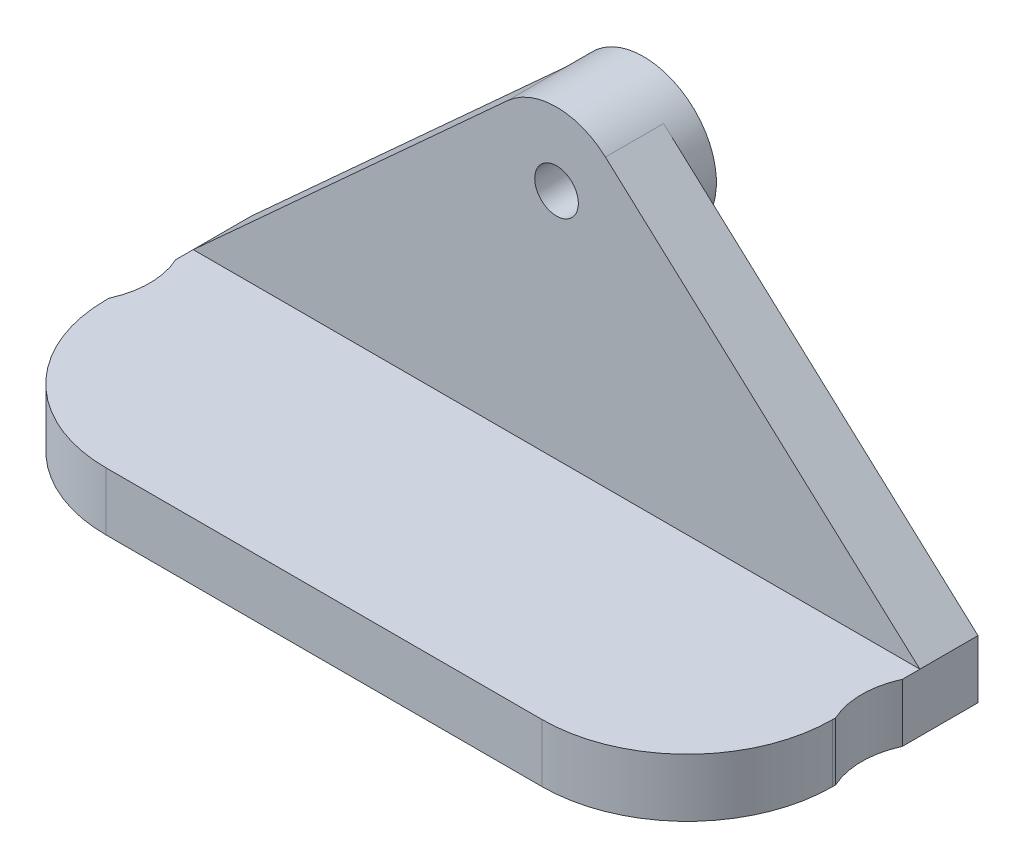
ISO-10303-21;
HEADER;
FILE_DESCRIPTION(('STEP AP214'),'2;1');
FILE_NAME('part.step','',(''),(''),'','','');
FILE_SCHEMA(('AUTOMOTIVE_DESIGN { 1 0 10303 214 1 1 1 1 }'));
ENDSEC;
DATA;
#1=APPLICATION_CONTEXT('core data for automotive mechanical design processes');
#2=APPLICATION_PROTOCOL_DEFINITION('international standard','automotive_design',2000,#1);
#3=PRODUCT_CONTEXT('',#1,'mechanical');
#4=PRODUCT('Part','Part','',(#3));
#5=PRODUCT_RELATED_PRODUCT_CATEGORY('part','',(#4));
#6=PRODUCT_DEFINITION_FORMATION('','',#4);
#7=PRODUCT_DEFINITION_CONTEXT('part definition',#1,'design');
#8=PRODUCT_DEFINITION('design','',#6,#7);
#9=PRODUCT_DEFINITION_SHAPE('','',#8);
#10=(LENGTH_UNIT() NAMED_UNIT(*) SI_UNIT(.MILLI.,.METRE.));
#11=(NAMED_UNIT(*) PLANE_ANGLE_UNIT() SI_UNIT($,.RADIAN.));
#12=(NAMED_UNIT(*) SI_UNIT($,.STERADIAN.) SOLID_ANGLE_UNIT());
#13=UNCERTAINTY_MEASURE_WITH_UNIT(LENGTH_MEASURE(1.E-05),#10,'distance_accuracy_value','');
#14=(GEOMETRIC_REPRESENTATION_CONTEXT(3) GLOBAL_UNCERTAINTY_ASSIGNED_CONTEXT((#13)) GLOBAL_UNIT_ASSIGNED_CONTEXT((#10,
#11,#12)) REPRESENTATION_CONTEXT('',''));
#15=CARTESIAN_POINT('',(0.,0.,0.));
#16=DIRECTION('',(0.,0.,1.));
#17=DIRECTION('',(1.,0.,0.));
#18=AXIS2_PLACEMENT_3D('',#15,#16,#17);
#19=CARTESIAN_POINT('',(25.,4.,10.));
#20=DIRECTION('',(-1.,0.,0.));
#21=DIRECTION('',(0.,0.,1.));
#22=AXIS2_PLACEMENT_3D('',#19,#20,#21);
#23=PLANE('',#22);
#24=DIRECTION('',(0.,0.,-1.));
#25=VECTOR('',#24,1.);
#26=CARTESIAN_POINT('',(25.,4.,10.));
#27=LINE('',#26,#25);
#28=CARTESIAN_POINT('',(25.,4.,0.));
#29=VERTEX_POINT('',#28);
#30=CARTESIAN_POINT('',(25.,4.,-0.208712152522062));
#31=VERTEX_POINT('',#30);
#32=EDGE_CURVE('E143',#29,#31,#27,.T.);
#33=ORIENTED_EDGE('',*,*,#32,.F.);
#34=DIRECTION('',(0.,-1.,0.));
#35=VECTOR('',#34,1.);
#36=CARTESIAN_POINT('',(25.,4.,0.));
#37=LINE('',#36,#35);
#38=CARTESIAN_POINT('',(25.,0.,0.));
#39=VERTEX_POINT('',#38);
#40=EDGE_CURVE('E244',#29,#39,#37,.T.);
#41=ORIENTED_EDGE('',*,*,#40,.T.);
#42=DIRECTION('',(0.,0.,-1.));
#43=VECTOR('',#42,1.);
#44=CARTESIAN_POINT('',(25.,0.,10.));
#45=LINE('',#44,#43);
#46=CARTESIAN_POINT('',(25.,0.,-0.208712152522062));
#47=VERTEX_POINT('',#46);
#48=EDGE_CURVE('E168',#39,#47,#45,.T.);
#49=ORIENTED_EDGE('',*,*,#48,.T.);
#50=DIRECTION('',(0.,1.,0.));
#51=VECTOR('',#50,1.);
#52=CARTESIAN_POINT('',(25.,-0.00100000000000013,-0.208712152522062));
#53=LINE('',#52,#51);
#54=EDGE_CURVE('E160',#31,#47,#53,.F.);
#55=ORIENTED_EDGE('',*,*,#54,.F.);
#56=EDGE_LOOP('',(#33,#41,#49,#55));
#57=FACE_BOUND('',#56,.T.);
#58=ADVANCED_FACE('F45',(#57),#23,.F.);
#59=CARTESIAN_POINT('',(-25.,4.,10.));
#60=DIRECTION('',(1.,0.,0.));
#61=DIRECTION('',(0.,0.,-1.));
#62=AXIS2_PLACEMENT_3D('',#59,#60,#61);
#63=PLANE('',#62);
#64=DIRECTION('',(0.,0.,1.));
#65=VECTOR('',#64,1.);
#66=CARTESIAN_POINT('',(-25.,0.,10.));
#67=LINE('',#66,#65);
#68=CARTESIAN_POINT('',(-25.,0.,-10.));
#69=VERTEX_POINT('',#68);
#70=CARTESIAN_POINT('',(-25.,0.,-4.79128784747789));
#71=VERTEX_POINT('',#70);
#72=EDGE_CURVE('E282',#69,#71,#67,.T.);
#73=ORIENTED_EDGE('',*,*,#72,.T.);
#74=DIRECTION('',(0.,1.,0.));
#75=VECTOR('',#74,1.);
#76=CARTESIAN_POINT('',(-25.,-0.00100000000000013,-4.79128784747789));
#77=LINE('',#76,#75);
#78=CARTESIAN_POINT('',(-25.,4.,-4.79128784747789));
#79=VERTEX_POINT('',#78);
#80=EDGE_CURVE('E179',#79,#71,#77,.F.);
#81=ORIENTED_EDGE('',*,*,#80,.F.);
#82=DIRECTION('',(0.,0.,1.));
#83=VECTOR('',#82,1.);
#84=CARTESIAN_POINT('',(-25.,4.,10.));
#85=LINE('',#84,#83);
#86=CARTESIAN_POINT('',(-25.,4.,-6.00000000000001));
#87=VERTEX_POINT('',#86);
#88=EDGE_CURVE('E261',#87,#79,#85,.T.);
#89=ORIENTED_EDGE('',*,*,#88,.F.);
#90=CARTESIAN_POINT('',(-25.,4.,-10.));
#91=VERTEX_POINT('',#90);
#92=EDGE_CURVE('E214',#91,#87,#85,.T.);
#93=ORIENTED_EDGE('',*,*,#92,.F.);
#94=DIRECTION('',(0.,-1.,0.));
#95=VECTOR('',#94,1.);
#96=CARTESIAN_POINT('',(-25.,4.,-10.));
#97=LINE('',#96,#95);
#98=EDGE_CURVE('E275',#91,#69,#97,.T.);
#99=ORIENTED_EDGE('',*,*,#98,.T.);
#100=EDGE_LOOP('',(#73,#81,#89,#93,#99));
#101=FACE_BOUND('',#100,.T.);
#102=ADVANCED_FACE('F317',(#101),#63,.F.);
#103=CARTESIAN_POINT('',(-25.,4.,-10.));
#104=DIRECTION('',(0.,0.,1.));
#105=DIRECTION('',(1.,0.,0.));
#106=AXIS2_PLACEMENT_3D('',#103,#104,#105);
#107=PLANE('',#106);
#108=CARTESIAN_POINT('',(0.,20.,-10.));
#109=DIRECTION('',(0.,0.,-1.));
#110=DIRECTION('',(-1.,0.,0.));
#111=AXIS2_PLACEMENT_3D('',#108,#109,#110);
#112=CIRCLE('',#111,5.);
#113=CARTESIAN_POINT('',(3.36617277427065,23.6971449597979,-10.));
#114=VERTEX_POINT('',#113);
#115=CARTESIAN_POINT('',(-3.36617277427066,23.6971449597979,-10.));
#116=VERTEX_POINT('',#115);
#117=EDGE_CURVE('E239',#114,#116,#112,.T.);
#118=ORIENTED_EDGE('',*,*,#117,.F.);
#119=DIRECTION('',(-0.73942899195958,0.673234554854131,0.));
#120=VECTOR('',#119,1.);
#121=CARTESIAN_POINT('',(13.3223557392336,14.6322496428051,-10.));
#122=LINE('',#121,#120);
#123=CARTESIAN_POINT('',(25.,4.,-10.));
#124=VERTEX_POINT('',#123);
#125=EDGE_CURVE('E232',#124,#114,#122,.T.);
#126=ORIENTED_EDGE('',*,*,#125,.F.);
#127=DIRECTION('',(0.,-1.,0.));
#128=VECTOR('',#127,1.);
#129=CARTESIAN_POINT('',(25.,4.,-10.));
#130=LINE('',#129,#128);
#131=CARTESIAN_POINT('',(25.,0.,-10.));
#132=VERTEX_POINT('',#131);
#133=EDGE_CURVE('E245',#124,#132,#130,.T.);
#134=ORIENTED_EDGE('',*,*,#133,.T.);
#135=DIRECTION('',(-1.,0.,0.));
#136=VECTOR('',#135,1.);
#137=CARTESIAN_POINT('',(-25.,0.,-10.));
#138=LINE('',#137,#136);
#139=EDGE_CURVE('E287',#132,#69,#138,.T.);
#140=ORIENTED_EDGE('',*,*,#139,.T.);
#141=ORIENTED_EDGE('',*,*,#98,.F.);
#142=DIRECTION('',(0.739428991959579,0.673234554854131,0.));
#143=VECTOR('',#142,1.);
#144=CARTESIAN_POINT('',(-13.3223557392336,14.6322496428051,-10.));
#145=LINE('',#144,#143);
#146=EDGE_CURVE('E197',#91,#116,#145,.T.);
#147=ORIENTED_EDGE('',*,*,#146,.T.);
#148=EDGE_LOOP('',(#118,#126,#134,#140,#141,#147));
#149=FACE_BOUND('',#148,.T.);
#150=ADVANCED_FACE('F301',(#149),#107,.F.);
#151=CARTESIAN_POINT('',(0.,4.,0.));
#152=DIRECTION('',(0.,-1.,0.));
#153=DIRECTION('',(0.,0.,-1.));
#154=AXIS2_PLACEMENT_3D('',#151,#152,#153);
#155=PLANE('',#154);
#156=DIRECTION('',(1.,0.,0.));
#157=VECTOR('',#156,1.);
#158=CARTESIAN_POINT('',(-25.,4.,10.));
#159=LINE('',#158,#157);
#160=CARTESIAN_POINT('',(-15.,4.,10.));
#161=VERTEX_POINT('',#160);
#162=CARTESIAN_POINT('',(15.,4.,10.));
#163=VERTEX_POINT('',#162);
#164=EDGE_CURVE('E265',#161,#163,#159,.T.);
#165=ORIENTED_EDGE('',*,*,#164,.T.);
#166=CARTESIAN_POINT('',(15.,4.,0.));
#167=DIRECTION('',(0.,-1.,0.));
#168=DIRECTION('',(0.,0.,-1.));
#169=AXIS2_PLACEMENT_3D('',#166,#167,#168);
#170=CIRCLE('',#169,10.);
#171=EDGE_CURVE('E54',#163,#29,#170,.F.);
#172=ORIENTED_EDGE('',*,*,#171,.T.);
#173=ORIENTED_EDGE('',*,*,#32,.T.);
#174=CARTESIAN_POINT('',(30.,4.,-2.50000000000001));
#175=DIRECTION('',(0.,1.,0.));
#176=DIRECTION('',(0.,0.,1.));
#177=AXIS2_PLACEMENT_3D('',#174,#175,#176);
#178=CIRCLE('',#177,5.5);
#179=CARTESIAN_POINT('',(25.,4.,-4.79128784747796));
#180=VERTEX_POINT('',#179);
#181=EDGE_CURVE('E146',#180,#31,#178,.T.);
#182=ORIENTED_EDGE('',*,*,#181,.F.);
#183=CARTESIAN_POINT('',(25.,4.,-6.00000000000001));
#184=VERTEX_POINT('',#183);
#185=EDGE_CURVE('E155',#180,#184,#27,.T.);
#186=ORIENTED_EDGE('',*,*,#185,.T.);
#187=DIRECTION('',(1.,0.,0.));
#188=VECTOR('',#187,1.);
#189=CARTESIAN_POINT('',(0.,4.,-6.00000000000001));
#190=LINE('',#189,#188);
#191=EDGE_CURVE('E209',#87,#184,#190,.T.);
#192=ORIENTED_EDGE('',*,*,#191,.F.);
#193=ORIENTED_EDGE('',*,*,#88,.T.);
#194=CARTESIAN_POINT('',(-30.,4.,-2.5));
#195=DIRECTION('',(0.,1.,0.));
#196=DIRECTION('',(0.,0.,1.));
#197=AXIS2_PLACEMENT_3D('',#194,#195,#196);
#198=CIRCLE('',#197,5.5);
#199=CARTESIAN_POINT('',(-25.,4.,-0.208712152522116));
#200=VERTEX_POINT('',#199);
#201=EDGE_CURVE('E182',#200,#79,#198,.T.);
#202=ORIENTED_EDGE('',*,*,#201,.F.);
#203=CARTESIAN_POINT('',(-25.,4.,0.));
#204=VERTEX_POINT('',#203);
#205=EDGE_CURVE('E154',#200,#204,#85,.T.);
#206=ORIENTED_EDGE('',*,*,#205,.T.);
#207=CARTESIAN_POINT('',(-15.,4.,0.));
#208=DIRECTION('',(0.,-1.,0.));
#209=DIRECTION('',(0.,0.,-1.));
#210=AXIS2_PLACEMENT_3D('',#207,#208,#209);
#211=CIRCLE('',#210,10.);
#212=EDGE_CURVE('E325',#204,#161,#211,.F.);
#213=ORIENTED_EDGE('',*,*,#212,.T.);
#214=EDGE_LOOP('',(#165,#172,#173,#182,#186,#192,#193,#202,#206,#213));
#215=FACE_BOUND('',#214,.T.);
#216=ADVANCED_FACE('F145',(#215),#155,.F.);
#217=ORIENTED_EDGE('',*,*,#185,.F.);
#218=DIRECTION('',(0.,1.,0.));
#219=VECTOR('',#218,1.);
#220=CARTESIAN_POINT('',(25.,-0.00100000000000013,-4.79128784747796));
#221=LINE('',#220,#219);
#222=CARTESIAN_POINT('',(25.,0.,-4.79128784747796));
#223=VERTEX_POINT('',#222);
#224=EDGE_CURVE('E163',#223,#180,#221,.T.);
#225=ORIENTED_EDGE('',*,*,#224,.F.);
#226=EDGE_CURVE('E221',#223,#132,#45,.T.);
#227=ORIENTED_EDGE('',*,*,#226,.T.);
#228=ORIENTED_EDGE('',*,*,#133,.F.);
#229=DIRECTION('',(0.,0.,-1.));
#230=VECTOR('',#229,1.);
#231=CARTESIAN_POINT('',(25.,4.,-6.00000000000001));
#232=LINE('',#231,#230);
#233=EDGE_CURVE('E217',#184,#124,#232,.T.);
#234=ORIENTED_EDGE('',*,*,#233,.F.);
#235=EDGE_LOOP('',(#217,#225,#227,#228,#234));
#236=FACE_BOUND('',#235,.T.);
#237=ADVANCED_FACE('F294',(#236),#23,.F.);
#238=CARTESIAN_POINT('',(-25.,0.,-0.208712152522116));
#239=VERTEX_POINT('',#238);
#240=CARTESIAN_POINT('',(-25.,0.,0.));
#241=VERTEX_POINT('',#240);
#242=EDGE_CURVE('E286',#239,#241,#67,.T.);
#243=ORIENTED_EDGE('',*,*,#242,.T.);
#244=DIRECTION('',(0.,-1.,0.));
#245=VECTOR('',#244,1.);
#246=CARTESIAN_POINT('',(-25.,4.,0.));
#247=LINE('',#246,#245);
#248=EDGE_CURVE('E11',#241,#204,#247,.F.);
#249=ORIENTED_EDGE('',*,*,#248,.T.);
#250=ORIENTED_EDGE('',*,*,#205,.F.);
#251=DIRECTION('',(0.,1.,0.));
#252=VECTOR('',#251,1.);
#253=CARTESIAN_POINT('',(-25.,-0.00100000000000013,-0.208712152522116));
#254=LINE('',#253,#252);
#255=EDGE_CURVE('E176',#239,#200,#254,.T.);
#256=ORIENTED_EDGE('',*,*,#255,.F.);
#257=EDGE_LOOP('',(#243,#249,#250,#256));
#258=FACE_BOUND('',#257,.T.);
#259=ADVANCED_FACE('F351',(#258),#63,.F.);
#260=CARTESIAN_POINT('',(-25.,4.,10.));
#261=DIRECTION('',(0.,0.,-1.));
#262=DIRECTION('',(-1.,0.,0.));
#263=AXIS2_PLACEMENT_3D('',#260,#261,#262);
#264=PLANE('',#263);
#265=DIRECTION('',(1.,0.,0.));
#266=VECTOR('',#265,1.);
#267=CARTESIAN_POINT('',(-25.,0.,10.));
#268=LINE('',#267,#266);
#269=CARTESIAN_POINT('',(-15.,0.,10.));
#270=VERTEX_POINT('',#269);
#271=CARTESIAN_POINT('',(15.,0.,10.));
#272=VERTEX_POINT('',#271);
#273=EDGE_CURVE('E279',#270,#272,#268,.T.);
#274=ORIENTED_EDGE('',*,*,#273,.T.);
#275=DIRECTION('',(0.,-1.,0.));
#276=VECTOR('',#275,1.);
#277=CARTESIAN_POINT('',(15.,4.,10.));
#278=LINE('',#277,#276);
#279=EDGE_CURVE('E67',#272,#163,#278,.F.);
#280=ORIENTED_EDGE('',*,*,#279,.T.);
#281=ORIENTED_EDGE('',*,*,#164,.F.);
#282=DIRECTION('',(0.,-1.,0.));
#283=VECTOR('',#282,1.);
#284=CARTESIAN_POINT('',(-15.,4.,10.));
#285=LINE('',#284,#283);
#286=EDGE_CURVE('E336',#161,#270,#285,.T.);
#287=ORIENTED_EDGE('',*,*,#286,.T.);
#288=EDGE_LOOP('',(#274,#280,#281,#287));
#289=FACE_BOUND('',#288,.T.);
#290=ADVANCED_FACE('F347',(#289),#264,.F.);
#291=CARTESIAN_POINT('',(0.,0.,0.));
#292=DIRECTION('',(0.,-1.,0.));
#293=DIRECTION('',(0.,0.,-1.));
#294=AXIS2_PLACEMENT_3D('',#291,#292,#293);
#295=PLANE('',#294);
#296=ORIENTED_EDGE('',*,*,#48,.F.);
#297=CARTESIAN_POINT('',(15.,0.,0.));
#298=DIRECTION('',(0.,-1.,0.));
#299=DIRECTION('',(0.,0.,-1.));
#300=AXIS2_PLACEMENT_3D('',#297,#298,#299);
#301=CIRCLE('',#300,10.);
#302=EDGE_CURVE('E339',#39,#272,#301,.T.);
#303=ORIENTED_EDGE('',*,*,#302,.T.);
#304=ORIENTED_EDGE('',*,*,#273,.F.);
#305=CARTESIAN_POINT('',(-15.,0.,0.));
#306=DIRECTION('',(0.,-1.,0.));
#307=DIRECTION('',(0.,0.,-1.));
#308=AXIS2_PLACEMENT_3D('',#305,#306,#307);
#309=CIRCLE('',#308,10.);
#310=EDGE_CURVE('E342',#270,#241,#309,.T.);
#311=ORIENTED_EDGE('',*,*,#310,.T.);
#312=ORIENTED_EDGE('',*,*,#242,.F.);
#313=CARTESIAN_POINT('',(-30.,0.,-2.5));
#314=DIRECTION('',(0.,-1.,0.));
#315=DIRECTION('',(0.,0.,-1.));
#316=AXIS2_PLACEMENT_3D('',#313,#314,#315);
#317=CIRCLE('',#316,5.5);
#318=EDGE_CURVE('E185',#239,#71,#317,.F.);
#319=ORIENTED_EDGE('',*,*,#318,.T.);
#320=ORIENTED_EDGE('',*,*,#72,.F.);
#321=ORIENTED_EDGE('',*,*,#139,.F.);
#322=ORIENTED_EDGE('',*,*,#226,.F.);
#323=CARTESIAN_POINT('',(30.,0.,-2.50000000000001));
#324=DIRECTION('',(0.,-1.,0.));
#325=DIRECTION('',(0.,0.,-1.));
#326=AXIS2_PLACEMENT_3D('',#323,#324,#325);
#327=CIRCLE('',#326,5.5);
#328=EDGE_CURVE('E165',#223,#47,#327,.F.);
#329=ORIENTED_EDGE('',*,*,#328,.T.);
#330=EDGE_LOOP('',(#296,#303,#304,#311,#312,#319,#320,#321,#322,#329));
#331=FACE_BOUND('',#330,.T.);
#332=ADVANCED_FACE('F298',(#331),#295,.T.);
#333=CARTESIAN_POINT('',(-13.3223557392336,14.6322496428051,-6.00000000000001));
#334=DIRECTION('',(-0.673234554854131,0.739428991959579,0.));
#335=DIRECTION('',(-0.739428991959579,-0.673234554854131,0.));
#336=AXIS2_PLACEMENT_3D('',#333,#334,#335);
#337=PLANE('',#336);
#338=ORIENTED_EDGE('',*,*,#146,.F.);
#339=ORIENTED_EDGE('',*,*,#92,.T.);
#340=DIRECTION('',(0.739428991959579,0.673234554854131,0.));
#341=VECTOR('',#340,1.);
#342=CARTESIAN_POINT('',(-13.3223557392336,14.6322496428051,-6.00000000000001));
#343=LINE('',#342,#341);
#344=CARTESIAN_POINT('',(-3.36617277427065,23.6971449597979,-6.00000000000001));
#345=VERTEX_POINT('',#344);
#346=EDGE_CURVE('E203',#87,#345,#343,.T.);
#347=ORIENTED_EDGE('',*,*,#346,.T.);
#348=DIRECTION('',(0.,0.,-1.));
#349=VECTOR('',#348,1.);
#350=CARTESIAN_POINT('',(-3.36617277427065,23.6971449597979,-6.00000000000001));
#351=LINE('',#350,#349);
#352=EDGE_CURVE('E251',#345,#116,#351,.T.);
#353=ORIENTED_EDGE('',*,*,#352,.T.);
#354=EDGE_LOOP('',(#338,#339,#347,#353));
#355=FACE_BOUND('',#354,.T.);
#356=ADVANCED_FACE('F320',(#355),#337,.T.);
#357=CARTESIAN_POINT('',(13.3223557392336,14.6322496428051,-6.00000000000001));
#358=DIRECTION('',(-0.673234554854131,-0.73942899195958,0.));
#359=DIRECTION('',(0.73942899195958,-0.673234554854131,0.));
#360=AXIS2_PLACEMENT_3D('',#357,#358,#359);
#361=PLANE('',#360);
#362=ORIENTED_EDGE('',*,*,#125,.T.);
#363=DIRECTION('',(0.,0.,-1.));
#364=VECTOR('',#363,1.);
#365=CARTESIAN_POINT('',(3.36617277427065,23.6971449597979,-6.00000000000001));
#366=LINE('',#365,#364);
#367=CARTESIAN_POINT('',(3.36617277427065,23.6971449597979,-6.00000000000001));
#368=VERTEX_POINT('',#367);
#369=EDGE_CURVE('E222',#368,#114,#366,.T.);
#370=ORIENTED_EDGE('',*,*,#369,.F.);
#371=DIRECTION('',(-0.73942899195958,0.673234554854131,0.));
#372=VECTOR('',#371,1.);
#373=CARTESIAN_POINT('',(13.3223557392336,14.6322496428051,-6.00000000000001));
#374=LINE('',#373,#372);
#375=EDGE_CURVE('E202',#184,#368,#374,.T.);
#376=ORIENTED_EDGE('',*,*,#375,.F.);
#377=ORIENTED_EDGE('',*,*,#233,.T.);
#378=EDGE_LOOP('',(#362,#370,#376,#377));
#379=FACE_BOUND('',#378,.T.);
#380=ADVANCED_FACE('F304',(#379),#361,.F.);
#381=CARTESIAN_POINT('',(0.,20.,-6.00000000000001));
#382=DIRECTION('',(0.,0.,-1.));
#383=DIRECTION('',(-1.,0.,0.));
#384=AXIS2_PLACEMENT_3D('',#381,#382,#383);
#385=CYLINDRICAL_SURFACE('',#384,5.);
#386=ORIENTED_EDGE('',*,*,#369,.T.);
#387=ORIENTED_EDGE('',*,*,#117,.T.);
#388=ORIENTED_EDGE('',*,*,#352,.F.);
#389=CARTESIAN_POINT('',(0.,20.,-6.00000000000001));
#390=DIRECTION('',(0.,0.,-1.));
#391=DIRECTION('',(-1.,0.,0.));
#392=AXIS2_PLACEMENT_3D('',#389,#390,#391);
#393=CIRCLE('',#392,5.);
#394=EDGE_CURVE('E198',#345,#368,#393,.T.);
#395=ORIENTED_EDGE('',*,*,#394,.T.);
#396=EDGE_LOOP('',(#386,#387,#388,#395));
#397=FACE_BOUND('',#396,.T.);
#398=CARTESIAN_POINT('',(0.,20.,-12.));
#399=DIRECTION('',(0.,0.,-1.));
#400=DIRECTION('',(-1.,0.,0.));
#401=AXIS2_PLACEMENT_3D('',#398,#399,#400);
#402=CIRCLE('',#401,5.);
#403=CARTESIAN_POINT('',(-5.,20.,-12.));
#404=VERTEX_POINT('',#403);
#405=EDGE_CURVE('E193',#404,#404,#402,.T.);
#406=ORIENTED_EDGE('',*,*,#405,.F.);
#407=EDGE_LOOP('',(#406));
#408=FACE_BOUND('',#407,.T.);
#409=ADVANCED_FACE('F359',(#397,#408),#385,.T.);
#410=CARTESIAN_POINT('',(0.,20.,-6.00000000000001));
#411=DIRECTION('',(0.,0.,-1.));
#412=DIRECTION('',(-1.,0.,0.));
#413=AXIS2_PLACEMENT_3D('',#410,#411,#412);
#414=CYLINDRICAL_SURFACE('',#413,1.5);
#415=CARTESIAN_POINT('',(0.,20.,-6.00000000000001));
#416=DIRECTION('',(0.,0.,-1.));
#417=DIRECTION('',(-1.,0.,0.));
#418=AXIS2_PLACEMENT_3D('',#415,#416,#417);
#419=CIRCLE('',#418,1.5);
#420=CARTESIAN_POINT('',(-1.5,20.,-6.00000000000001));
#421=VERTEX_POINT('',#420);
#422=EDGE_CURVE('E206',#421,#421,#419,.T.);
#423=ORIENTED_EDGE('',*,*,#422,.F.);
#424=EDGE_LOOP('',(#423));
#425=FACE_BOUND('',#424,.T.);
#426=CARTESIAN_POINT('',(0.,20.,-12.));
#427=DIRECTION('',(0.,0.,-1.));
#428=DIRECTION('',(-1.,0.,0.));
#429=AXIS2_PLACEMENT_3D('',#426,#427,#428);
#430=CIRCLE('',#429,1.5);
#431=CARTESIAN_POINT('',(-1.5,20.,-12.));
#432=VERTEX_POINT('',#431);
#433=EDGE_CURVE('E189',#432,#432,#430,.T.);
#434=ORIENTED_EDGE('',*,*,#433,.T.);
#435=EDGE_LOOP('',(#434));
#436=FACE_BOUND('',#435,.T.);
#437=ADVANCED_FACE('F362',(#425,#436),#414,.F.);
#438=CARTESIAN_POINT('',(0.,0.,-6.00000000000001));
#439=DIRECTION('',(0.,0.,-1.));
#440=DIRECTION('',(-1.,0.,0.));
#441=AXIS2_PLACEMENT_3D('',#438,#439,#440);
#442=PLANE('',#441);
#443=ORIENTED_EDGE('',*,*,#346,.F.);
#444=ORIENTED_EDGE('',*,*,#191,.T.);
#445=ORIENTED_EDGE('',*,*,#375,.T.);
#446=ORIENTED_EDGE('',*,*,#394,.F.);
#447=EDGE_LOOP('',(#443,#444,#445,#446));
#448=FACE_BOUND('',#447,.T.);
#449=ORIENTED_EDGE('',*,*,#422,.T.);
#450=EDGE_LOOP('',(#449));
#451=FACE_BOUND('',#450,.T.);
#452=ADVANCED_FACE('F308',(#448,#451),#442,.F.);
#453=CARTESIAN_POINT('',(0.,0.,-12.));
#454=DIRECTION('',(0.,0.,-1.));
#455=DIRECTION('',(-1.,0.,0.));
#456=AXIS2_PLACEMENT_3D('',#453,#454,#455);
#457=PLANE('',#456);
#458=ORIENTED_EDGE('',*,*,#433,.F.);
#459=EDGE_LOOP('',(#458));
#460=FACE_BOUND('',#459,.T.);
#461=ORIENTED_EDGE('',*,*,#405,.T.);
#462=EDGE_LOOP('',(#461));
#463=FACE_BOUND('',#462,.T.);
#464=ADVANCED_FACE('F366',(#460,#463),#457,.T.);
#465=CARTESIAN_POINT('',(-30.,-0.00100000000000013,-2.5));
#466=DIRECTION('',(0.,1.,0.));
#467=DIRECTION('',(0.,0.,1.));
#468=AXIS2_PLACEMENT_3D('',#465,#466,#467);
#469=CYLINDRICAL_SURFACE('',#468,5.5);
#470=ORIENTED_EDGE('',*,*,#80,.T.);
#471=ORIENTED_EDGE('',*,*,#318,.F.);
#472=ORIENTED_EDGE('',*,*,#255,.T.);
#473=ORIENTED_EDGE('',*,*,#201,.T.);
#474=EDGE_LOOP('',(#470,#471,#472,#473));
#475=FACE_BOUND('',#474,.T.);
#476=ADVANCED_FACE('F355',(#475),#469,.F.);
#477=CARTESIAN_POINT('',(30.,-0.00100000000000013,-2.50000000000001));
#478=DIRECTION('',(0.,1.,0.));
#479=DIRECTION('',(0.,0.,1.));
#480=AXIS2_PLACEMENT_3D('',#477,#478,#479);
#481=CYLINDRICAL_SURFACE('',#480,5.5);
#482=ORIENTED_EDGE('',*,*,#54,.T.);
#483=ORIENTED_EDGE('',*,*,#328,.F.);
#484=ORIENTED_EDGE('',*,*,#224,.T.);
#485=ORIENTED_EDGE('',*,*,#181,.T.);
#486=EDGE_LOOP('',(#482,#483,#484,#485));
#487=FACE_BOUND('',#486,.T.);
#488=ADVANCED_FACE('F159',(#487),#481,.F.);
#489=CARTESIAN_POINT('',(15.,4.,0.));
#490=DIRECTION('',(0.,-1.,0.));
#491=DIRECTION('',(0.,0.,-1.));
#492=AXIS2_PLACEMENT_3D('',#489,#490,#491);
#493=CYLINDRICAL_SURFACE('',#492,10.);
#494=ORIENTED_EDGE('',*,*,#171,.F.);
#495=ORIENTED_EDGE('',*,*,#279,.F.);
#496=ORIENTED_EDGE('',*,*,#302,.F.);
#497=ORIENTED_EDGE('',*,*,#40,.F.);
#498=EDGE_LOOP('',(#494,#495,#496,#497));
#499=FACE_BOUND('',#498,.T.);
#500=ADVANCED_FACE('F329',(#499),#493,.T.);
#501=CARTESIAN_POINT('',(-15.,4.,0.));
#502=DIRECTION('',(0.,-1.,0.));
#503=DIRECTION('',(0.,0.,-1.));
#504=AXIS2_PLACEMENT_3D('',#501,#502,#503);
#505=CYLINDRICAL_SURFACE('',#504,10.);
#506=ORIENTED_EDGE('',*,*,#212,.F.);
#507=ORIENTED_EDGE('',*,*,#248,.F.);
#508=ORIENTED_EDGE('',*,*,#310,.F.);
#509=ORIENTED_EDGE('',*,*,#286,.F.);
#510=EDGE_LOOP('',(#506,#507,#508,#509));
#511=FACE_BOUND('',#510,.T.);
#512=ADVANCED_FACE('F47',(#511),#505,.T.);
#513=CLOSED_SHELL('',(#58,#102,#150,#216,#237,#259,#290,#332,#356,#380,#409,#437,#452,#464,#476,
#488,#500,#512));
#514=MANIFOLD_SOLID_BREP('B2',#513);
#515=ADVANCED_BREP_SHAPE_REPRESENTATION('',(#18,#514),#14);
#516=SHAPE_DEFINITION_REPRESENTATION(#9,#515);
ENDSEC;
END-ISO-10303-21;
